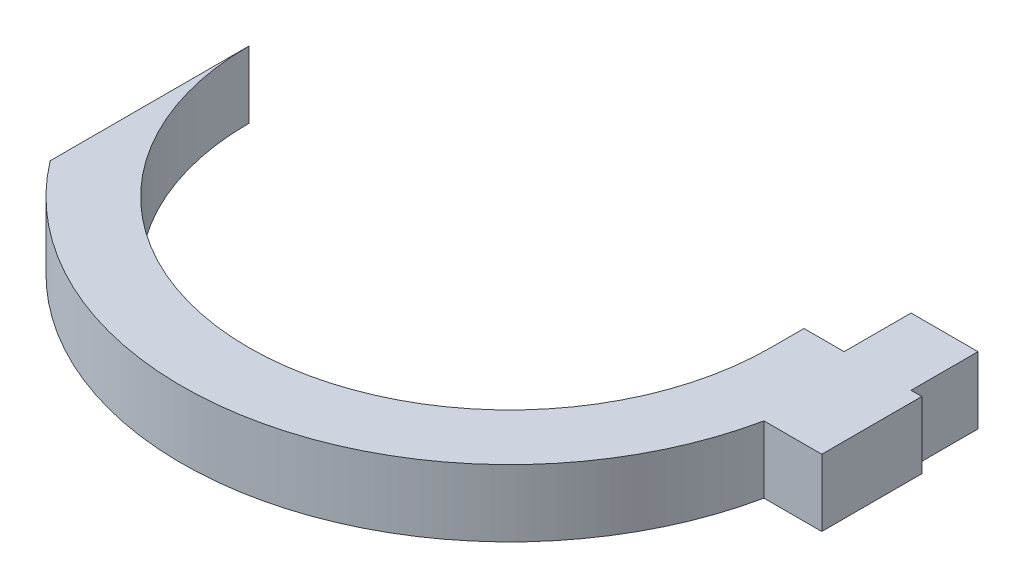
ISO-10303-21;
HEADER;
FILE_DESCRIPTION(('STEP AP214'),'2;1');
FILE_NAME('part.step','',(''),(''),'','','');
FILE_SCHEMA(('AUTOMOTIVE_DESIGN { 1 0 10303 214 1 1 1 1 }'));
ENDSEC;
DATA;
#1=APPLICATION_CONTEXT('core data for automotive mechanical design processes');
#2=APPLICATION_PROTOCOL_DEFINITION('international standard','automotive_design',2000,#1);
#3=PRODUCT_CONTEXT('',#1,'mechanical');
#4=PRODUCT('Part','Part','',(#3));
#5=PRODUCT_RELATED_PRODUCT_CATEGORY('part','',(#4));
#6=PRODUCT_DEFINITION_FORMATION('','',#4);
#7=PRODUCT_DEFINITION_CONTEXT('part definition',#1,'design');
#8=PRODUCT_DEFINITION('design','',#6,#7);
#9=PRODUCT_DEFINITION_SHAPE('','',#8);
#10=(LENGTH_UNIT() NAMED_UNIT(*) SI_UNIT(.MILLI.,.METRE.));
#11=(NAMED_UNIT(*) PLANE_ANGLE_UNIT() SI_UNIT($,.RADIAN.));
#12=(NAMED_UNIT(*) SI_UNIT($,.STERADIAN.) SOLID_ANGLE_UNIT());
#13=UNCERTAINTY_MEASURE_WITH_UNIT(LENGTH_MEASURE(1.E-05),#10,'distance_accuracy_value','');
#14=(GEOMETRIC_REPRESENTATION_CONTEXT(3) GLOBAL_UNCERTAINTY_ASSIGNED_CONTEXT((#13)) GLOBAL_UNIT_ASSIGNED_CONTEXT((#10,
#11,#12)) REPRESENTATION_CONTEXT('',''));
#15=CARTESIAN_POINT('',(0.,0.,0.));
#16=DIRECTION('',(0.,0.,1.));
#17=DIRECTION('',(1.,0.,0.));
#18=AXIS2_PLACEMENT_3D('',#15,#16,#17);
#19=CARTESIAN_POINT('',(59.69,6.35,-9.48767931527347));
#20=DIRECTION('',(-1.,0.,0.));
#21=DIRECTION('',(0.,0.,1.));
#22=AXIS2_PLACEMENT_3D('',#19,#20,#21);
#23=PLANE('',#22);
#24=DIRECTION('',(0.,0.,-1.));
#25=VECTOR('',#24,1.);
#26=CARTESIAN_POINT('',(59.69,0.,-9.48767931527347));
#27=LINE('',#26,#25);
#28=CARTESIAN_POINT('',(59.69,0.,-3.13767931527347));
#29=VERTEX_POINT('',#28);
#30=CARTESIAN_POINT('',(59.69,0.,-9.48767931527347));
#31=VERTEX_POINT('',#30);
#32=EDGE_CURVE('E147',#29,#31,#27,.T.);
#33=ORIENTED_EDGE('',*,*,#32,.T.);
#34=DIRECTION('',(0.,-1.,0.));
#35=VECTOR('',#34,1.);
#36=CARTESIAN_POINT('',(59.69,6.35,-9.48767931527347));
#37=LINE('',#36,#35);
#38=CARTESIAN_POINT('',(59.69,6.35,-9.48767931527347));
#39=VERTEX_POINT('',#38);
#40=EDGE_CURVE('E11',#39,#31,#37,.T.);
#41=ORIENTED_EDGE('',*,*,#40,.F.);
#42=DIRECTION('',(0.,0.,-1.));
#43=VECTOR('',#42,1.);
#44=CARTESIAN_POINT('',(59.69,6.35,-9.48767931527347));
#45=LINE('',#44,#43);
#46=CARTESIAN_POINT('',(59.69,6.35,-3.13767931527347));
#47=VERTEX_POINT('',#46);
#48=EDGE_CURVE('E167',#47,#39,#45,.T.);
#49=ORIENTED_EDGE('',*,*,#48,.F.);
#50=DIRECTION('',(0.,-1.,0.));
#51=VECTOR('',#50,1.);
#52=CARTESIAN_POINT('',(59.69,6.35,-3.13767931527347));
#53=LINE('',#52,#51);
#54=EDGE_CURVE('E143',#47,#29,#53,.T.);
#55=ORIENTED_EDGE('',*,*,#54,.T.);
#56=EDGE_LOOP('',(#33,#41,#49,#55));
#57=FACE_BOUND('',#56,.T.);
#58=ADVANCED_FACE('F33',(#57),#23,.F.);
#59=CARTESIAN_POINT('',(53.34,6.35,-9.48767931527347));
#60=DIRECTION('',(0.,0.,1.));
#61=DIRECTION('',(1.,0.,0.));
#62=AXIS2_PLACEMENT_3D('',#59,#60,#61);
#63=PLANE('',#62);
#64=DIRECTION('',(-1.,0.,0.));
#65=VECTOR('',#64,1.);
#66=CARTESIAN_POINT('',(53.34,0.,-9.48767931527347));
#67=LINE('',#66,#65);
#68=CARTESIAN_POINT('',(53.34,0.,-9.48767931527347));
#69=VERTEX_POINT('',#68);
#70=EDGE_CURVE('E150',#31,#69,#67,.T.);
#71=ORIENTED_EDGE('',*,*,#70,.T.);
#72=DIRECTION('',(0.,-1.,0.));
#73=VECTOR('',#72,1.);
#74=CARTESIAN_POINT('',(53.34,6.35,-9.48767931527347));
#75=LINE('',#74,#73);
#76=CARTESIAN_POINT('',(53.34,6.35,-9.48767931527347));
#77=VERTEX_POINT('',#76);
#78=EDGE_CURVE('E41',#77,#69,#75,.T.);
#79=ORIENTED_EDGE('',*,*,#78,.F.);
#80=DIRECTION('',(-1.,0.,0.));
#81=VECTOR('',#80,1.);
#82=CARTESIAN_POINT('',(53.34,6.35,-9.48767931527347));
#83=LINE('',#82,#81);
#84=EDGE_CURVE('E100',#39,#77,#83,.T.);
#85=ORIENTED_EDGE('',*,*,#84,.F.);
#86=ORIENTED_EDGE('',*,*,#40,.T.);
#87=EDGE_LOOP('',(#71,#79,#85,#86));
#88=FACE_BOUND('',#87,.T.);
#89=ADVANCED_FACE('F239',(#88),#63,.F.);
#90=CARTESIAN_POINT('',(53.34,6.35,-3.13767931527347));
#91=DIRECTION('',(1.,0.,0.));
#92=DIRECTION('',(0.,0.,-1.));
#93=AXIS2_PLACEMENT_3D('',#90,#91,#92);
#94=PLANE('',#93);
#95=DIRECTION('',(0.,0.,1.));
#96=VECTOR('',#95,1.);
#97=CARTESIAN_POINT('',(53.34,0.,-3.13767931527347));
#98=LINE('',#97,#96);
#99=CARTESIAN_POINT('',(53.34,0.,-3.13767931527347));
#100=VERTEX_POINT('',#99);
#101=EDGE_CURVE('E152',#69,#100,#98,.T.);
#102=ORIENTED_EDGE('',*,*,#101,.T.);
#103=DIRECTION('',(0.,-1.,0.));
#104=VECTOR('',#103,1.);
#105=CARTESIAN_POINT('',(53.34,6.35,-3.13767931527347));
#106=LINE('',#105,#104);
#107=CARTESIAN_POINT('',(53.34,6.35,-3.13767931527347));
#108=VERTEX_POINT('',#107);
#109=EDGE_CURVE('E183',#108,#100,#106,.T.);
#110=ORIENTED_EDGE('',*,*,#109,.F.);
#111=DIRECTION('',(0.,0.,1.));
#112=VECTOR('',#111,1.);
#113=CARTESIAN_POINT('',(53.34,6.35,-3.13767931527347));
#114=LINE('',#113,#112);
#115=EDGE_CURVE('E191',#77,#108,#114,.T.);
#116=ORIENTED_EDGE('',*,*,#115,.F.);
#117=ORIENTED_EDGE('',*,*,#78,.T.);
#118=EDGE_LOOP('',(#102,#110,#116,#117));
#119=FACE_BOUND('',#118,.T.);
#120=ADVANCED_FACE('F189',(#119),#94,.F.);
#121=CARTESIAN_POINT('',(49.53,6.35,-3.13767931527347));
#122=DIRECTION('',(0.,0.,1.));
#123=DIRECTION('',(1.,0.,0.));
#124=AXIS2_PLACEMENT_3D('',#121,#122,#123);
#125=PLANE('',#124);
#126=DIRECTION('',(-1.,0.,0.));
#127=VECTOR('',#126,1.);
#128=CARTESIAN_POINT('',(49.53,0.,-3.13767931527347));
#129=LINE('',#128,#127);
#130=CARTESIAN_POINT('',(49.53,0.,-3.13767931527347));
#131=VERTEX_POINT('',#130);
#132=EDGE_CURVE('E154',#100,#131,#129,.T.);
#133=ORIENTED_EDGE('',*,*,#132,.T.);
#134=DIRECTION('',(0.,-1.,0.));
#135=VECTOR('',#134,1.);
#136=CARTESIAN_POINT('',(49.53,6.35,-3.13767931527347));
#137=LINE('',#136,#135);
#138=CARTESIAN_POINT('',(49.53,6.35,-3.13767931527347));
#139=VERTEX_POINT('',#138);
#140=EDGE_CURVE('E180',#139,#131,#137,.T.);
#141=ORIENTED_EDGE('',*,*,#140,.F.);
#142=DIRECTION('',(-1.,0.,0.));
#143=VECTOR('',#142,1.);
#144=CARTESIAN_POINT('',(49.53,6.35,-3.13767931527347));
#145=LINE('',#144,#143);
#146=EDGE_CURVE('E209',#108,#139,#145,.T.);
#147=ORIENTED_EDGE('',*,*,#146,.F.);
#148=ORIENTED_EDGE('',*,*,#109,.T.);
#149=EDGE_LOOP('',(#133,#141,#147,#148));
#150=FACE_BOUND('',#149,.T.);
#151=ADVANCED_FACE('F200',(#150),#125,.F.);
#152=CARTESIAN_POINT('',(49.53,6.35,0.));
#153=DIRECTION('',(1.,0.,0.));
#154=DIRECTION('',(0.,0.,-1.));
#155=AXIS2_PLACEMENT_3D('',#152,#153,#154);
#156=PLANE('',#155);
#157=DIRECTION('',(0.,0.,1.));
#158=VECTOR('',#157,1.);
#159=CARTESIAN_POINT('',(49.53,0.,0.));
#160=LINE('',#159,#158);
#161=CARTESIAN_POINT('',(49.53,0.,0.));
#162=VERTEX_POINT('',#161);
#163=EDGE_CURVE('E156',#131,#162,#160,.T.);
#164=ORIENTED_EDGE('',*,*,#163,.T.);
#165=DIRECTION('',(0.,-1.,0.));
#166=VECTOR('',#165,1.);
#167=CARTESIAN_POINT('',(49.53,6.35,0.));
#168=LINE('',#167,#166);
#169=CARTESIAN_POINT('',(49.53,6.35,0.));
#170=VERTEX_POINT('',#169);
#171=EDGE_CURVE('E177',#170,#162,#168,.T.);
#172=ORIENTED_EDGE('',*,*,#171,.F.);
#173=DIRECTION('',(0.,0.,1.));
#174=VECTOR('',#173,1.);
#175=CARTESIAN_POINT('',(49.53,6.35,0.));
#176=LINE('',#175,#174);
#177=EDGE_CURVE('E206',#139,#170,#176,.T.);
#178=ORIENTED_EDGE('',*,*,#177,.F.);
#179=ORIENTED_EDGE('',*,*,#140,.T.);
#180=EDGE_LOOP('',(#164,#172,#178,#179));
#181=FACE_BOUND('',#180,.T.);
#182=ADVANCED_FACE('F204',(#181),#156,.F.);
#183=CARTESIAN_POINT('',(24.765,6.35,0.));
#184=DIRECTION('',(0.,-1.,0.));
#185=DIRECTION('',(0.,0.,-1.));
#186=AXIS2_PLACEMENT_3D('',#183,#184,#185);
#187=CYLINDRICAL_SURFACE('',#186,24.765);
#188=CARTESIAN_POINT('',(24.765,0.,0.));
#189=DIRECTION('',(0.,-1.,0.));
#190=DIRECTION('',(0.,0.,-1.));
#191=AXIS2_PLACEMENT_3D('',#188,#189,#190);
#192=CIRCLE('',#191,24.765);
#193=CARTESIAN_POINT('',(0.,0.,0.));
#194=VERTEX_POINT('',#193);
#195=EDGE_CURVE('E158',#162,#194,#192,.T.);
#196=ORIENTED_EDGE('',*,*,#195,.T.);
#197=DIRECTION('',(0.,-1.,0.));
#198=VECTOR('',#197,1.);
#199=CARTESIAN_POINT('',(0.,6.35,0.));
#200=LINE('',#199,#198);
#201=CARTESIAN_POINT('',(0.,6.35,0.));
#202=VERTEX_POINT('',#201);
#203=EDGE_CURVE('E174',#202,#194,#200,.T.);
#204=ORIENTED_EDGE('',*,*,#203,.F.);
#205=CARTESIAN_POINT('',(24.765,6.35,0.));
#206=DIRECTION('',(0.,-1.,0.));
#207=DIRECTION('',(0.,0.,-1.));
#208=AXIS2_PLACEMENT_3D('',#205,#206,#207);
#209=CIRCLE('',#208,24.765);
#210=EDGE_CURVE('E208',#170,#202,#209,.T.);
#211=ORIENTED_EDGE('',*,*,#210,.F.);
#212=ORIENTED_EDGE('',*,*,#171,.T.);
#213=EDGE_LOOP('',(#196,#204,#211,#212));
#214=FACE_BOUND('',#213,.T.);
#215=ADVANCED_FACE('F252',(#214),#187,.F.);
#216=CARTESIAN_POINT('',(0.,6.35,0.));
#217=DIRECTION('',(1.,0.,0.));
#218=DIRECTION('',(0.,0.,-1.));
#219=AXIS2_PLACEMENT_3D('',#216,#217,#218);
#220=PLANE('',#219);
#221=DIRECTION('',(0.,0.,1.));
#222=VECTOR('',#221,1.);
#223=CARTESIAN_POINT('',(0.,0.,0.));
#224=LINE('',#223,#222);
#225=CARTESIAN_POINT('',(0.,0.,18.837144157223));
#226=VERTEX_POINT('',#225);
#227=EDGE_CURVE('E160',#194,#226,#224,.T.);
#228=ORIENTED_EDGE('',*,*,#227,.T.);
#229=DIRECTION('',(0.,-1.,0.));
#230=VECTOR('',#229,1.);
#231=CARTESIAN_POINT('',(0.,6.35,18.837144157223));
#232=LINE('',#231,#230);
#233=CARTESIAN_POINT('',(0.,6.35,18.837144157223));
#234=VERTEX_POINT('',#233);
#235=EDGE_CURVE('E171',#234,#226,#232,.T.);
#236=ORIENTED_EDGE('',*,*,#235,.F.);
#237=DIRECTION('',(0.,0.,1.));
#238=VECTOR('',#237,1.);
#239=CARTESIAN_POINT('',(0.,6.35,0.));
#240=LINE('',#239,#238);
#241=EDGE_CURVE('E211',#202,#234,#240,.T.);
#242=ORIENTED_EDGE('',*,*,#241,.F.);
#243=ORIENTED_EDGE('',*,*,#203,.T.);
#244=EDGE_LOOP('',(#228,#236,#242,#243));
#245=FACE_BOUND('',#244,.T.);
#246=ADVANCED_FACE('F220',(#245),#220,.F.);
#247=CARTESIAN_POINT('',(24.765,6.35,0.));
#248=DIRECTION('',(0.,-1.,0.));
#249=DIRECTION('',(0.,0.,-1.));
#250=AXIS2_PLACEMENT_3D('',#247,#248,#249);
#251=CYLINDRICAL_SURFACE('',#250,31.115);
#252=CARTESIAN_POINT('',(24.765,0.,0.));
#253=DIRECTION('',(0.,1.,0.));
#254=DIRECTION('',(0.,0.,1.));
#255=AXIS2_PLACEMENT_3D('',#252,#253,#254);
#256=CIRCLE('',#255,31.115);
#257=CARTESIAN_POINT('',(55.2251497862371,0.,6.35000000000001));
#258=VERTEX_POINT('',#257);
#259=EDGE_CURVE('E162',#226,#258,#256,.T.);
#260=ORIENTED_EDGE('',*,*,#259,.T.);
#261=DIRECTION('',(0.,-1.,0.));
#262=VECTOR('',#261,1.);
#263=CARTESIAN_POINT('',(55.2251497862371,6.35,6.35000000000001));
#264=LINE('',#263,#262);
#265=CARTESIAN_POINT('',(55.2251497862371,6.35,6.35000000000001));
#266=VERTEX_POINT('',#265);
#267=EDGE_CURVE('E138',#266,#258,#264,.T.);
#268=ORIENTED_EDGE('',*,*,#267,.F.);
#269=CARTESIAN_POINT('',(24.765,6.35,0.));
#270=DIRECTION('',(0.,1.,0.));
#271=DIRECTION('',(0.,0.,1.));
#272=AXIS2_PLACEMENT_3D('',#269,#270,#271);
#273=CIRCLE('',#272,31.115);
#274=EDGE_CURVE('E128',#234,#266,#273,.T.);
#275=ORIENTED_EDGE('',*,*,#274,.F.);
#276=ORIENTED_EDGE('',*,*,#235,.T.);
#277=EDGE_LOOP('',(#260,#268,#275,#276));
#278=FACE_BOUND('',#277,.T.);
#279=ADVANCED_FACE('F224',(#278),#251,.T.);
#280=CARTESIAN_POINT('',(60.706,6.35,6.35));
#281=DIRECTION('',(0.,0.,-1.));
#282=DIRECTION('',(-1.,0.,0.));
#283=AXIS2_PLACEMENT_3D('',#280,#281,#282);
#284=PLANE('',#283);
#285=DIRECTION('',(1.,0.,0.));
#286=VECTOR('',#285,1.);
#287=CARTESIAN_POINT('',(60.706,0.,6.35));
#288=LINE('',#287,#286);
#289=CARTESIAN_POINT('',(60.706,0.,6.35));
#290=VERTEX_POINT('',#289);
#291=EDGE_CURVE('E137',#258,#290,#288,.T.);
#292=ORIENTED_EDGE('',*,*,#291,.T.);
#293=DIRECTION('',(0.,-1.,0.));
#294=VECTOR('',#293,1.);
#295=CARTESIAN_POINT('',(60.706,6.35,6.35));
#296=LINE('',#295,#294);
#297=CARTESIAN_POINT('',(60.706,6.35,6.35));
#298=VERTEX_POINT('',#297);
#299=EDGE_CURVE('E134',#298,#290,#296,.T.);
#300=ORIENTED_EDGE('',*,*,#299,.F.);
#301=DIRECTION('',(1.,0.,0.));
#302=VECTOR('',#301,1.);
#303=CARTESIAN_POINT('',(60.706,6.35,6.35));
#304=LINE('',#303,#302);
#305=EDGE_CURVE('E122',#266,#298,#304,.T.);
#306=ORIENTED_EDGE('',*,*,#305,.F.);
#307=ORIENTED_EDGE('',*,*,#267,.T.);
#308=EDGE_LOOP('',(#292,#300,#306,#307));
#309=FACE_BOUND('',#308,.T.);
#310=ADVANCED_FACE('F135',(#309),#284,.F.);
#311=CARTESIAN_POINT('',(60.706,6.35,0.));
#312=DIRECTION('',(-1.,0.,0.));
#313=DIRECTION('',(0.,0.,1.));
#314=AXIS2_PLACEMENT_3D('',#311,#312,#313);
#315=PLANE('',#314);
#316=DIRECTION('',(0.,0.,-1.));
#317=VECTOR('',#316,1.);
#318=CARTESIAN_POINT('',(60.706,0.,0.));
#319=LINE('',#318,#317);
#320=CARTESIAN_POINT('',(60.706,0.,-3.13767931527347));
#321=VERTEX_POINT('',#320);
#322=EDGE_CURVE('E86',#290,#321,#319,.T.);
#323=ORIENTED_EDGE('',*,*,#322,.T.);
#324=DIRECTION('',(0.,-1.,0.));
#325=VECTOR('',#324,1.);
#326=CARTESIAN_POINT('',(60.706,6.35,-3.13767931527347));
#327=LINE('',#326,#325);
#328=CARTESIAN_POINT('',(60.706,6.35,-3.13767931527347));
#329=VERTEX_POINT('',#328);
#330=EDGE_CURVE('E139',#329,#321,#327,.T.);
#331=ORIENTED_EDGE('',*,*,#330,.F.);
#332=DIRECTION('',(0.,0.,-1.));
#333=VECTOR('',#332,1.);
#334=CARTESIAN_POINT('',(60.706,6.35,0.));
#335=LINE('',#334,#333);
#336=EDGE_CURVE('E126',#298,#329,#335,.T.);
#337=ORIENTED_EDGE('',*,*,#336,.F.);
#338=ORIENTED_EDGE('',*,*,#299,.T.);
#339=EDGE_LOOP('',(#323,#331,#337,#338));
#340=FACE_BOUND('',#339,.T.);
#341=ADVANCED_FACE('F141',(#340),#315,.F.);
#342=CARTESIAN_POINT('',(60.706,6.35,-3.13767931527347));
#343=DIRECTION('',(0.,0.,1.));
#344=DIRECTION('',(1.,0.,0.));
#345=AXIS2_PLACEMENT_3D('',#342,#343,#344);
#346=PLANE('',#345);
#347=DIRECTION('',(-1.,0.,0.));
#348=VECTOR('',#347,1.);
#349=CARTESIAN_POINT('',(60.706,0.,-3.13767931527347));
#350=LINE('',#349,#348);
#351=EDGE_CURVE('E92',#321,#29,#350,.T.);
#352=ORIENTED_EDGE('',*,*,#351,.T.);
#353=ORIENTED_EDGE('',*,*,#54,.F.);
#354=DIRECTION('',(-1.,0.,0.));
#355=VECTOR('',#354,1.);
#356=CARTESIAN_POINT('',(60.706,6.35,-3.13767931527347));
#357=LINE('',#356,#355);
#358=EDGE_CURVE('E49',#329,#47,#357,.T.);
#359=ORIENTED_EDGE('',*,*,#358,.F.);
#360=ORIENTED_EDGE('',*,*,#330,.T.);
#361=EDGE_LOOP('',(#352,#353,#359,#360));
#362=FACE_BOUND('',#361,.T.);
#363=ADVANCED_FACE('F228',(#362),#346,.F.);
#364=CARTESIAN_POINT('',(24.765,6.35,0.));
#365=DIRECTION('',(0.,1.,0.));
#366=DIRECTION('',(0.,0.,1.));
#367=AXIS2_PLACEMENT_3D('',#364,#365,#366);
#368=PLANE('',#367);
#369=ORIENTED_EDGE('',*,*,#48,.T.);
#370=ORIENTED_EDGE('',*,*,#84,.T.);
#371=ORIENTED_EDGE('',*,*,#115,.T.);
#372=ORIENTED_EDGE('',*,*,#146,.T.);
#373=ORIENTED_EDGE('',*,*,#177,.T.);
#374=ORIENTED_EDGE('',*,*,#210,.T.);
#375=ORIENTED_EDGE('',*,*,#241,.T.);
#376=ORIENTED_EDGE('',*,*,#274,.T.);
#377=ORIENTED_EDGE('',*,*,#305,.T.);
#378=ORIENTED_EDGE('',*,*,#336,.T.);
#379=ORIENTED_EDGE('',*,*,#358,.T.);
#380=EDGE_LOOP('',(#369,#370,#371,#372,#373,#374,#375,#376,#377,#378,#379));
#381=FACE_BOUND('',#380,.T.);
#382=ADVANCED_FACE('F124',(#381),#368,.T.);
#383=CARTESIAN_POINT('',(24.765,0.,0.));
#384=DIRECTION('',(0.,1.,0.));
#385=DIRECTION('',(0.,0.,1.));
#386=AXIS2_PLACEMENT_3D('',#383,#384,#385);
#387=PLANE('',#386);
#388=ORIENTED_EDGE('',*,*,#32,.F.);
#389=ORIENTED_EDGE('',*,*,#351,.F.);
#390=ORIENTED_EDGE('',*,*,#322,.F.);
#391=ORIENTED_EDGE('',*,*,#291,.F.);
#392=ORIENTED_EDGE('',*,*,#259,.F.);
#393=ORIENTED_EDGE('',*,*,#227,.F.);
#394=ORIENTED_EDGE('',*,*,#195,.F.);
#395=ORIENTED_EDGE('',*,*,#163,.F.);
#396=ORIENTED_EDGE('',*,*,#132,.F.);
#397=ORIENTED_EDGE('',*,*,#101,.F.);
#398=ORIENTED_EDGE('',*,*,#70,.F.);
#399=EDGE_LOOP('',(#388,#389,#390,#391,#392,#393,#394,#395,#396,#397,#398));
#400=FACE_BOUND('',#399,.T.);
#401=ADVANCED_FACE('F195',(#400),#387,.F.);
#402=CLOSED_SHELL('',(#58,#89,#120,#151,#182,#215,#246,#279,#310,#341,#363,#382,#401));
#403=MANIFOLD_SOLID_BREP('B2',#402);
#404=ADVANCED_BREP_SHAPE_REPRESENTATION('',(#18,#403),#14);
#405=SHAPE_DEFINITION_REPRESENTATION(#9,#404);
ENDSEC;
END-ISO-10303-21;
